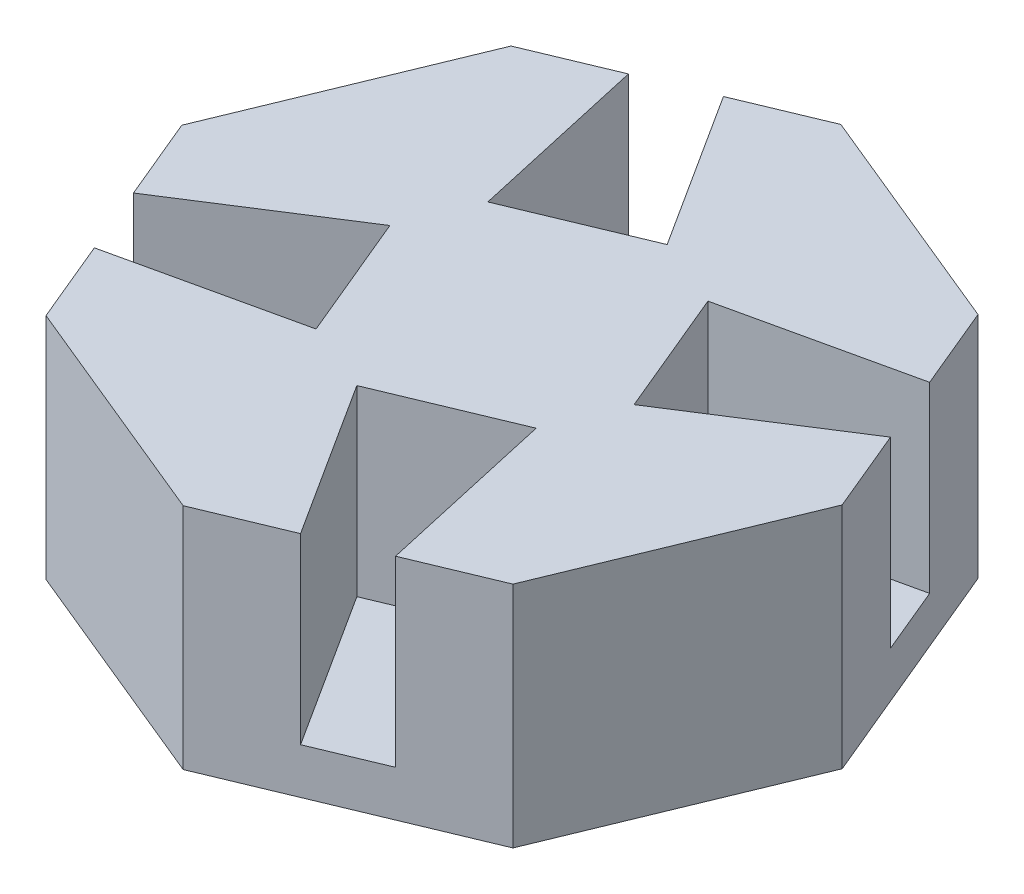
ISO-10303-21;
HEADER;
FILE_DESCRIPTION(('STEP AP214'),'2;1');
FILE_NAME('part.step','',(''),(''),'','','');
FILE_SCHEMA(('AUTOMOTIVE_DESIGN { 1 0 10303 214 1 1 1 1 }'));
ENDSEC;
DATA;
#1=APPLICATION_CONTEXT('core data for automotive mechanical design processes');
#2=APPLICATION_PROTOCOL_DEFINITION('international standard','automotive_design',2000,#1);
#3=PRODUCT_CONTEXT('',#1,'mechanical');
#4=PRODUCT('Part','Part','',(#3));
#5=PRODUCT_RELATED_PRODUCT_CATEGORY('part','',(#4));
#6=PRODUCT_DEFINITION_FORMATION('','',#4);
#7=PRODUCT_DEFINITION_CONTEXT('part definition',#1,'design');
#8=PRODUCT_DEFINITION('design','',#6,#7);
#9=PRODUCT_DEFINITION_SHAPE('','',#8);
#10=(LENGTH_UNIT() NAMED_UNIT(*) SI_UNIT(.MILLI.,.METRE.));
#11=(NAMED_UNIT(*) PLANE_ANGLE_UNIT() SI_UNIT($,.RADIAN.));
#12=(NAMED_UNIT(*) SI_UNIT($,.STERADIAN.) SOLID_ANGLE_UNIT());
#13=UNCERTAINTY_MEASURE_WITH_UNIT(LENGTH_MEASURE(1.E-05),#10,'distance_accuracy_value','');
#14=(GEOMETRIC_REPRESENTATION_CONTEXT(3) GLOBAL_UNCERTAINTY_ASSIGNED_CONTEXT((#13)) GLOBAL_UNIT_ASSIGNED_CONTEXT((#10,
#11,#12)) REPRESENTATION_CONTEXT('',''));
#15=CARTESIAN_POINT('',(0.,0.,0.));
#16=DIRECTION('',(0.,0.,1.));
#17=DIRECTION('',(1.,0.,0.));
#18=AXIS2_PLACEMENT_3D('',#15,#16,#17);
#19=CARTESIAN_POINT('',(-0.111992667325423,38.1,-54.9379232963896));
#20=DIRECTION('',(0.384565990508202,0.,0.923097502403969));
#21=DIRECTION('',(0.923097502403969,0.,-0.384565990508202));
#22=AXIS2_PLACEMENT_3D('',#19,#20,#21);
#23=PLANE('',#22);
#24=DIRECTION('',(0.,1.,0.));
#25=VECTOR('',#24,1.);
#26=CARTESIAN_POINT('',(-25.1089472041907,7.62000000000001,-44.524095335504));
#27=LINE('',#26,#25);
#28=CARTESIAN_POINT('',(-25.1089472041907,7.62000000000001,-44.524095335504));
#29=VERTEX_POINT('',#28);
#30=CARTESIAN_POINT('',(-25.1089472041907,38.1,-44.524095335504));
#31=VERTEX_POINT('',#30);
#32=EDGE_CURVE('E248',#29,#31,#27,.T.);
#33=ORIENTED_EDGE('',*,*,#32,.F.);
#34=DIRECTION('',(-0.923097502403969,0.,0.384565990508202));
#35=VECTOR('',#34,1.);
#36=CARTESIAN_POINT('',(-19.5190807745089,7.62000000000001,-46.8528553145321));
#37=LINE('',#36,#35);
#38=CARTESIAN_POINT('',(-13.9292143448195,7.62000000000001,-49.1816152935633));
#39=VERTEX_POINT('',#38);
#40=EDGE_CURVE('E272',#39,#29,#37,.T.);
#41=ORIENTED_EDGE('',*,*,#40,.F.);
#42=DIRECTION('',(0.,1.,0.));
#43=VECTOR('',#42,1.);
#44=CARTESIAN_POINT('',(-13.9292143448195,7.62000000000001,-49.1816152935633));
#45=LINE('',#44,#43);
#46=CARTESIAN_POINT('',(-13.9292143448195,38.1,-49.1816152935633));
#47=VERTEX_POINT('',#46);
#48=EDGE_CURVE('E288',#39,#47,#45,.T.);
#49=ORIENTED_EDGE('',*,*,#48,.T.);
#50=DIRECTION('',(-0.923097502403969,0.,0.384565990508202));
#51=VECTOR('',#50,1.);
#52=CARTESIAN_POINT('',(-0.111992667325423,38.1,-54.9379232963896));
#53=LINE('',#52,#51);
#54=CARTESIAN_POINT('',(-0.111992667325423,38.1,-54.9379232963896));
#55=VERTEX_POINT('',#54);
#56=EDGE_CURVE('E379',#55,#47,#53,.T.);
#57=ORIENTED_EDGE('',*,*,#56,.F.);
#58=DIRECTION('',(0.,-1.,0.));
#59=VECTOR('',#58,1.);
#60=CARTESIAN_POINT('',(-0.111992667325423,38.1,-54.9379232963896));
#61=LINE('',#60,#59);
#62=CARTESIAN_POINT('',(-0.111992667325423,0.,-54.9379232963896));
#63=VERTEX_POINT('',#62);
#64=EDGE_CURVE('E11',#55,#63,#61,.T.);
#65=ORIENTED_EDGE('',*,*,#64,.T.);
#66=DIRECTION('',(-0.923097502403969,0.,0.384565990508202));
#67=VECTOR('',#66,1.);
#68=CARTESIAN_POINT('',(-0.111992667325423,0.,-54.9379232963896));
#69=LINE('',#68,#67);
#70=CARTESIAN_POINT('',(-38.9261688816924,0.,-38.7677873326745));
#71=VERTEX_POINT('',#70);
#72=EDGE_CURVE('E411',#63,#71,#69,.T.);
#73=ORIENTED_EDGE('',*,*,#72,.T.);
#74=DIRECTION('',(0.,-1.,0.));
#75=VECTOR('',#74,1.);
#76=CARTESIAN_POINT('',(-38.9261688816924,38.1,-38.7677873326745));
#77=LINE('',#76,#75);
#78=CARTESIAN_POINT('',(-38.9261688816924,38.1,-38.7677873326745));
#79=VERTEX_POINT('',#78);
#80=EDGE_CURVE('E54',#79,#71,#77,.T.);
#81=ORIENTED_EDGE('',*,*,#80,.F.);
#82=EDGE_CURVE('E377',#31,#79,#53,.T.);
#83=ORIENTED_EDGE('',*,*,#82,.F.);
#84=EDGE_LOOP('',(#33,#41,#49,#57,#65,#73,#81,#83));
#85=FACE_BOUND('',#84,.T.);
#86=ADVANCED_FACE('F45',(#85),#23,.F.);
#87=CARTESIAN_POINT('',(-54.9379232963896,38.1,0.111992667325427));
#88=DIRECTION('',(0.923097502403969,0.,-0.384565990508202));
#89=DIRECTION('',(-0.384565990508203,0.,-0.923097502403969));
#90=AXIS2_PLACEMENT_3D('',#87,#88,#89);
#91=PLANE('',#90);
#92=DIRECTION('',(0.,1.,0.));
#93=VECTOR('',#92,1.);
#94=CARTESIAN_POINT('',(-44.5240953355033,7.62000000000001,25.1089472041923));
#95=LINE('',#94,#93);
#96=CARTESIAN_POINT('',(-44.5240953355033,7.62000000000001,25.1089472041923));
#97=VERTEX_POINT('',#96);
#98=CARTESIAN_POINT('',(-44.5240953355033,38.1,25.1089472041923));
#99=VERTEX_POINT('',#98);
#100=EDGE_CURVE('E251',#97,#99,#95,.T.);
#101=ORIENTED_EDGE('',*,*,#100,.F.);
#102=DIRECTION('',(0.384565990508203,0.,0.923097502403969));
#103=VECTOR('',#102,1.);
#104=CARTESIAN_POINT('',(-46.8528553145321,7.62000000000001,19.5190807745089));
#105=LINE('',#104,#103);
#106=CARTESIAN_POINT('',(-49.1816152935624,7.62000000000001,13.9292143448218));
#107=VERTEX_POINT('',#106);
#108=EDGE_CURVE('E230',#107,#97,#105,.T.);
#109=ORIENTED_EDGE('',*,*,#108,.F.);
#110=DIRECTION('',(0.,1.,0.));
#111=VECTOR('',#110,1.);
#112=CARTESIAN_POINT('',(-49.1816152935624,7.62000000000001,13.9292143448218));
#113=LINE('',#112,#111);
#114=CARTESIAN_POINT('',(-49.1816152935624,38.1,13.9292143448218));
#115=VERTEX_POINT('',#114);
#116=EDGE_CURVE('E255',#107,#115,#113,.T.);
#117=ORIENTED_EDGE('',*,*,#116,.T.);
#118=DIRECTION('',(0.384565990508203,0.,0.923097502403969));
#119=VECTOR('',#118,1.);
#120=CARTESIAN_POINT('',(-54.9379232963896,38.1,0.111992667325427));
#121=LINE('',#120,#119);
#122=CARTESIAN_POINT('',(-54.9379232963896,38.1,0.111992667325427));
#123=VERTEX_POINT('',#122);
#124=EDGE_CURVE('E387',#123,#115,#121,.T.);
#125=ORIENTED_EDGE('',*,*,#124,.F.);
#126=DIRECTION('',(0.,-1.,0.));
#127=VECTOR('',#126,1.);
#128=CARTESIAN_POINT('',(-54.9379232963896,38.1,0.111992667325427));
#129=LINE('',#128,#127);
#130=CARTESIAN_POINT('',(-54.9379232963896,0.,0.111992667325427));
#131=VERTEX_POINT('',#130);
#132=EDGE_CURVE('E450',#123,#131,#129,.T.);
#133=ORIENTED_EDGE('',*,*,#132,.T.);
#134=DIRECTION('',(0.384565990508203,0.,0.923097502403969));
#135=VECTOR('',#134,1.);
#136=CARTESIAN_POINT('',(-54.9379232963896,0.,0.111992667325427));
#137=LINE('',#136,#135);
#138=CARTESIAN_POINT('',(-38.7677873326745,0.,38.9261688816925));
#139=VERTEX_POINT('',#138);
#140=EDGE_CURVE('E417',#131,#139,#137,.T.);
#141=ORIENTED_EDGE('',*,*,#140,.T.);
#142=DIRECTION('',(0.,-1.,0.));
#143=VECTOR('',#142,1.);
#144=CARTESIAN_POINT('',(-38.7677873326745,38.1,38.9261688816925));
#145=LINE('',#144,#143);
#146=CARTESIAN_POINT('',(-38.7677873326745,38.1,38.9261688816925));
#147=VERTEX_POINT('',#146);
#148=EDGE_CURVE('E446',#147,#139,#145,.T.);
#149=ORIENTED_EDGE('',*,*,#148,.F.);
#150=EDGE_CURVE('E386',#99,#147,#121,.T.);
#151=ORIENTED_EDGE('',*,*,#150,.F.);
#152=EDGE_LOOP('',(#101,#109,#117,#125,#133,#141,#149,#151));
#153=FACE_BOUND('',#152,.T.);
#154=ADVANCED_FACE('F471',(#153),#91,.F.);
#155=CARTESIAN_POINT('',(0.111992667325429,38.1,54.9379232963896));
#156=DIRECTION('',(-0.384565990508203,0.,-0.923097502403969));
#157=DIRECTION('',(-0.923097502403969,0.,0.384565990508203));
#158=AXIS2_PLACEMENT_3D('',#155,#156,#157);
#159=PLANE('',#158);
#160=DIRECTION('',(0.,1.,0.));
#161=VECTOR('',#160,1.);
#162=CARTESIAN_POINT('',(25.1089472041945,7.62000000000001,44.5240953355024));
#163=LINE('',#162,#161);
#164=CARTESIAN_POINT('',(25.1089472041945,7.62000000000001,44.5240953355024));
#165=VERTEX_POINT('',#164);
#166=CARTESIAN_POINT('',(25.1089472041945,38.1,44.5240953355024));
#167=VERTEX_POINT('',#166);
#168=EDGE_CURVE('E363',#165,#167,#163,.T.);
#169=ORIENTED_EDGE('',*,*,#168,.F.);
#170=DIRECTION('',(0.923097502403969,0.,-0.384565990508203));
#171=VECTOR('',#170,1.);
#172=CARTESIAN_POINT('',(19.519080774509,7.62000000000001,46.8528553145321));
#173=LINE('',#172,#171);
#174=CARTESIAN_POINT('',(13.9292143448233,7.62000000000001,49.1816152935618));
#175=VERTEX_POINT('',#174);
#176=EDGE_CURVE('E341',#175,#165,#173,.T.);
#177=ORIENTED_EDGE('',*,*,#176,.F.);
#178=DIRECTION('',(0.,1.,0.));
#179=VECTOR('',#178,1.);
#180=CARTESIAN_POINT('',(13.9292143448233,7.62000000000001,49.1816152935618));
#181=LINE('',#180,#179);
#182=CARTESIAN_POINT('',(13.9292143448233,38.1,49.1816152935618));
#183=VERTEX_POINT('',#182);
#184=EDGE_CURVE('E366',#175,#183,#181,.T.);
#185=ORIENTED_EDGE('',*,*,#184,.T.);
#186=DIRECTION('',(0.923097502403969,0.,-0.384565990508203));
#187=VECTOR('',#186,1.);
#188=CARTESIAN_POINT('',(0.111992667325429,38.1,54.9379232963896));
#189=LINE('',#188,#187);
#190=CARTESIAN_POINT('',(0.111992667325429,38.1,54.9379232963896));
#191=VERTEX_POINT('',#190);
#192=EDGE_CURVE('E395',#191,#183,#189,.T.);
#193=ORIENTED_EDGE('',*,*,#192,.F.);
#194=DIRECTION('',(0.,-1.,0.));
#195=VECTOR('',#194,1.);
#196=CARTESIAN_POINT('',(0.111992667325429,38.1,54.9379232963896));
#197=LINE('',#196,#195);
#198=CARTESIAN_POINT('',(0.111992667325429,0.,54.9379232963896));
#199=VERTEX_POINT('',#198);
#200=EDGE_CURVE('E442',#191,#199,#197,.T.);
#201=ORIENTED_EDGE('',*,*,#200,.T.);
#202=DIRECTION('',(0.923097502403969,0.,-0.384565990508203));
#203=VECTOR('',#202,1.);
#204=CARTESIAN_POINT('',(0.111992667325429,0.,54.9379232963896));
#205=LINE('',#204,#203);
#206=CARTESIAN_POINT('',(38.9261688816925,0.,38.7677873326745));
#207=VERTEX_POINT('',#206);
#208=EDGE_CURVE('E423',#199,#207,#205,.T.);
#209=ORIENTED_EDGE('',*,*,#208,.T.);
#210=DIRECTION('',(0.,-1.,0.));
#211=VECTOR('',#210,1.);
#212=CARTESIAN_POINT('',(38.9261688816925,38.1,38.7677873326745));
#213=LINE('',#212,#211);
#214=CARTESIAN_POINT('',(38.9261688816925,38.1,38.7677873326745));
#215=VERTEX_POINT('',#214);
#216=EDGE_CURVE('E438',#215,#207,#213,.T.);
#217=ORIENTED_EDGE('',*,*,#216,.F.);
#218=EDGE_CURVE('E394',#167,#215,#189,.T.);
#219=ORIENTED_EDGE('',*,*,#218,.F.);
#220=EDGE_LOOP('',(#169,#177,#185,#193,#201,#209,#217,#219));
#221=FACE_BOUND('',#220,.T.);
#222=ADVANCED_FACE('F515',(#221),#159,.F.);
#223=CARTESIAN_POINT('',(54.9379232963896,38.1,-0.111992667325405));
#224=DIRECTION('',(-0.923097502403969,0.,0.384565990508202));
#225=DIRECTION('',(0.384565990508202,0.,0.923097502403969));
#226=AXIS2_PLACEMENT_3D('',#223,#224,#225);
#227=PLANE('',#226);
#228=DIRECTION('',(0.,1.,0.));
#229=VECTOR('',#228,1.);
#230=CARTESIAN_POINT('',(44.5240953355031,7.62000000000001,-25.1089472041929));
#231=LINE('',#230,#229);
#232=CARTESIAN_POINT('',(44.5240953355031,7.62000000000001,-25.1089472041929));
#233=VERTEX_POINT('',#232);
#234=CARTESIAN_POINT('',(44.5240953355031,38.1,-25.1089472041929));
#235=VERTEX_POINT('',#234);
#236=EDGE_CURVE('E280',#233,#235,#231,.T.);
#237=ORIENTED_EDGE('',*,*,#236,.F.);
#238=DIRECTION('',(-0.384565990508202,0.,-0.923097502403969));
#239=VECTOR('',#238,1.);
#240=CARTESIAN_POINT('',(46.8528553145321,7.62000000000001,-19.5190807745089));
#241=LINE('',#240,#239);
#242=CARTESIAN_POINT('',(49.1816152935627,7.62000000000001,-13.9292143448211));
#243=VERTEX_POINT('',#242);
#244=EDGE_CURVE('E308',#243,#233,#241,.T.);
#245=ORIENTED_EDGE('',*,*,#244,.F.);
#246=DIRECTION('',(0.,1.,0.));
#247=VECTOR('',#246,1.);
#248=CARTESIAN_POINT('',(49.1816152935627,7.62000000000001,-13.9292143448211));
#249=LINE('',#248,#247);
#250=CARTESIAN_POINT('',(49.1816152935627,38.1,-13.9292143448211));
#251=VERTEX_POINT('',#250);
#252=EDGE_CURVE('E323',#243,#251,#249,.T.);
#253=ORIENTED_EDGE('',*,*,#252,.T.);
#254=DIRECTION('',(-0.384565990508202,0.,-0.923097502403969));
#255=VECTOR('',#254,1.);
#256=CARTESIAN_POINT('',(54.9379232963896,38.1,-0.111992667325405));
#257=LINE('',#256,#255);
#258=CARTESIAN_POINT('',(54.9379232963896,38.1,-0.111992667325405));
#259=VERTEX_POINT('',#258);
#260=EDGE_CURVE('E403',#259,#251,#257,.T.);
#261=ORIENTED_EDGE('',*,*,#260,.F.);
#262=DIRECTION('',(0.,-1.,0.));
#263=VECTOR('',#262,1.);
#264=CARTESIAN_POINT('',(54.9379232963896,38.1,-0.111992667325405));
#265=LINE('',#264,#263);
#266=CARTESIAN_POINT('',(54.9379232963896,0.,-0.111992667325405));
#267=VERTEX_POINT('',#266);
#268=EDGE_CURVE('E434',#259,#267,#265,.T.);
#269=ORIENTED_EDGE('',*,*,#268,.T.);
#270=DIRECTION('',(-0.384565990508202,0.,-0.923097502403969));
#271=VECTOR('',#270,1.);
#272=CARTESIAN_POINT('',(54.9379232963896,0.,-0.111992667325405));
#273=LINE('',#272,#271);
#274=CARTESIAN_POINT('',(38.7677873326746,0.,-38.9261688816924));
#275=VERTEX_POINT('',#274);
#276=EDGE_CURVE('E378',#267,#275,#273,.T.);
#277=ORIENTED_EDGE('',*,*,#276,.T.);
#278=DIRECTION('',(0.,-1.,0.));
#279=VECTOR('',#278,1.);
#280=CARTESIAN_POINT('',(38.7677873326746,38.1,-38.9261688816924));
#281=LINE('',#280,#279);
#282=CARTESIAN_POINT('',(38.7677873326746,38.1,-38.9261688816924));
#283=VERTEX_POINT('',#282);
#284=EDGE_CURVE('E407',#283,#275,#281,.T.);
#285=ORIENTED_EDGE('',*,*,#284,.F.);
#286=EDGE_CURVE('E402',#235,#283,#257,.T.);
#287=ORIENTED_EDGE('',*,*,#286,.F.);
#288=EDGE_LOOP('',(#237,#245,#253,#261,#269,#277,#285,#287));
#289=FACE_BOUND('',#288,.T.);
#290=ADVANCED_FACE('F505',(#289),#227,.F.);
#291=CARTESIAN_POINT('',(0.,38.1,0.));
#292=DIRECTION('',(0.,1.,0.));
#293=DIRECTION('',(0.,0.,1.));
#294=AXIS2_PLACEMENT_3D('',#291,#292,#293);
#295=PLANE('',#294);
#296=DIRECTION('',(-0.384565990508192,0.,-0.923097502403973));
#297=VECTOR('',#296,1.);
#298=CARTESIAN_POINT('',(18.716843441261,38.1,-7.79750938381947));
#299=LINE('',#298,#297);
#300=CARTESIAN_POINT('',(23.1124327127702,38.1,2.75349506865927));
#301=VERTEX_POINT('',#300);
#302=CARTESIAN_POINT('',(14.321254169753,38.1,-18.3485138362956));
#303=VERTEX_POINT('',#302);
#304=EDGE_CURVE('E315',#301,#303,#299,.T.);
#305=ORIENTED_EDGE('',*,*,#304,.T.);
#306=DIRECTION('',(0.975852760598065,0.,-0.218429369895938));
#307=VECTOR('',#306,1.);
#308=CARTESIAN_POINT('',(-3.22778876040923,38.1,-14.4204351913544));
#309=LINE('',#308,#307);
#310=EDGE_CURVE('E61',#303,#235,#309,.T.);
#311=ORIENTED_EDGE('',*,*,#310,.T.);
#312=ORIENTED_EDGE('',*,*,#286,.T.);
#313=DIRECTION('',(-0.924657723348283,0.,-0.38079928394414));
#314=VECTOR('',#313,1.);
#315=CARTESIAN_POINT('',(38.7677873326746,38.1,-38.9261688816924));
#316=LINE('',#315,#314);
#317=EDGE_CURVE('E373',#283,#55,#316,.T.);
#318=ORIENTED_EDGE('',*,*,#317,.T.);
#319=ORIENTED_EDGE('',*,*,#56,.T.);
#320=DIRECTION('',(-0.539017768098629,0.,-0.842294393709214));
#321=VECTOR('',#320,1.);
#322=CARTESIAN_POINT('',(12.4468077633807,38.1,-7.96520859058015));
#323=LINE('',#322,#321);
#324=CARTESIAN_POINT('',(2.75349506866189,38.1,-23.1124327127691));
#325=VERTEX_POINT('',#324);
#326=EDGE_CURVE('E265',#325,#47,#323,.T.);
#327=ORIENTED_EDGE('',*,*,#326,.F.);
#328=DIRECTION('',(-0.923097502403973,0.,0.384565990508192));
#329=VECTOR('',#328,1.);
#330=CARTESIAN_POINT('',(-7.79750938381868,38.1,-18.7168434412591));
#331=LINE('',#330,#329);
#332=CARTESIAN_POINT('',(-18.3485138362929,38.1,-14.3212541697518));
#333=VERTEX_POINT('',#332);
#334=EDGE_CURVE('E279',#325,#333,#331,.T.);
#335=ORIENTED_EDGE('',*,*,#334,.T.);
#336=DIRECTION('',(-0.218429369895938,0.,-0.975852760598065));
#337=VECTOR('',#336,1.);
#338=CARTESIAN_POINT('',(-14.4204351913522,38.1,3.22778876040873));
#339=LINE('',#338,#337);
#340=EDGE_CURVE('E69',#333,#31,#339,.T.);
#341=ORIENTED_EDGE('',*,*,#340,.T.);
#342=ORIENTED_EDGE('',*,*,#82,.T.);
#343=DIRECTION('',(-0.38079928394414,0.,0.924657723348283));
#344=VECTOR('',#343,1.);
#345=CARTESIAN_POINT('',(-38.9261688816924,38.1,-38.7677873326745));
#346=LINE('',#345,#344);
#347=EDGE_CURVE('E383',#79,#123,#346,.T.);
#348=ORIENTED_EDGE('',*,*,#347,.T.);
#349=ORIENTED_EDGE('',*,*,#124,.T.);
#350=DIRECTION('',(-0.842294393709214,0.,0.539017768098629));
#351=VECTOR('',#350,1.);
#352=CARTESIAN_POINT('',(-7.96520859057888,38.1,-12.4468077633787));
#353=LINE('',#352,#351);
#354=CARTESIAN_POINT('',(-23.1124327127665,38.1,-2.75349506866076));
#355=VERTEX_POINT('',#354);
#356=EDGE_CURVE('E236',#355,#115,#353,.T.);
#357=ORIENTED_EDGE('',*,*,#356,.F.);
#358=DIRECTION('',(0.384565990508192,0.,0.923097502403973));
#359=VECTOR('',#358,1.);
#360=CARTESIAN_POINT('',(-18.7168434412573,38.1,7.79750938381792));
#361=LINE('',#360,#359);
#362=CARTESIAN_POINT('',(-14.3212541697492,38.1,18.3485138362941));
#363=VERTEX_POINT('',#362);
#364=EDGE_CURVE('E239',#355,#363,#361,.T.);
#365=ORIENTED_EDGE('',*,*,#364,.T.);
#366=DIRECTION('',(-0.975852760598065,0.,0.218429369895937));
#367=VECTOR('',#366,1.);
#368=CARTESIAN_POINT('',(3.22778876040909,38.1,14.4204351913538));
#369=LINE('',#368,#367);
#370=EDGE_CURVE('E228',#363,#99,#369,.T.);
#371=ORIENTED_EDGE('',*,*,#370,.T.);
#372=ORIENTED_EDGE('',*,*,#150,.T.);
#373=DIRECTION('',(0.924657723348283,0.,0.38079928394414));
#374=VECTOR('',#373,1.);
#375=CARTESIAN_POINT('',(-38.7677873326745,38.1,38.9261688816925));
#376=LINE('',#375,#374);
#377=EDGE_CURVE('E391',#147,#191,#376,.T.);
#378=ORIENTED_EDGE('',*,*,#377,.T.);
#379=ORIENTED_EDGE('',*,*,#192,.T.);
#380=DIRECTION('',(0.539017768098629,0.,0.842294393709214));
#381=VECTOR('',#380,1.);
#382=CARTESIAN_POINT('',(-12.4468077633773,38.1,7.96520859057801));
#383=LINE('',#382,#381);
#384=CARTESIAN_POINT('',(-2.75349506865813,38.1,23.1124327127676));
#385=VERTEX_POINT('',#384);
#386=EDGE_CURVE('E352',#385,#183,#383,.T.);
#387=ORIENTED_EDGE('',*,*,#386,.F.);
#388=DIRECTION('',(0.923097502403973,0.,-0.384565990508192));
#389=VECTOR('',#388,1.);
#390=CARTESIAN_POINT('',(7.79750938381871,38.1,18.7168434412592));
#391=LINE('',#390,#389);
#392=CARTESIAN_POINT('',(18.3485138362967,38.1,14.3212541697503));
#393=VERTEX_POINT('',#392);
#394=EDGE_CURVE('E254',#385,#393,#391,.T.);
#395=ORIENTED_EDGE('',*,*,#394,.T.);
#396=DIRECTION('',(0.218429369895938,0.,0.975852760598065));
#397=VECTOR('',#396,1.);
#398=CARTESIAN_POINT('',(14.4204351913561,38.1,-3.2277887604096));
#399=LINE('',#398,#397);
#400=EDGE_CURVE('E337',#393,#167,#399,.T.);
#401=ORIENTED_EDGE('',*,*,#400,.T.);
#402=ORIENTED_EDGE('',*,*,#218,.T.);
#403=DIRECTION('',(0.38079928394414,0.,-0.924657723348283));
#404=VECTOR('',#403,1.);
#405=CARTESIAN_POINT('',(38.9261688816925,38.1,38.7677873326745));
#406=LINE('',#405,#404);
#407=EDGE_CURVE('E399',#215,#259,#406,.T.);
#408=ORIENTED_EDGE('',*,*,#407,.T.);
#409=ORIENTED_EDGE('',*,*,#260,.T.);
#410=DIRECTION('',(0.842294393709214,0.,-0.539017768098629));
#411=VECTOR('',#410,1.);
#412=CARTESIAN_POINT('',(7.96520859057929,38.1,12.4468077633793));
#413=LINE('',#412,#411);
#414=EDGE_CURVE('E301',#301,#251,#413,.T.);
#415=ORIENTED_EDGE('',*,*,#414,.F.);
#416=EDGE_LOOP('',(#305,#311,#312,#318,#319,#327,#335,#341,#342,#348,#349,#357,#365,#371,#372,
#378,#379,#387,#395,#401,#402,#408,#409,#415));
#417=FACE_BOUND('',#416,.T.);
#418=ADVANCED_FACE('F480',(#417),#295,.T.);
#419=CARTESIAN_POINT('',(38.7677873326746,38.1,-38.9261688816924));
#420=DIRECTION('',(-0.38079928394414,0.,0.924657723348283));
#421=DIRECTION('',(0.924657723348283,0.,0.38079928394414));
#422=AXIS2_PLACEMENT_3D('',#419,#420,#421);
#423=PLANE('',#422);
#424=DIRECTION('',(-0.924657723348283,0.,-0.38079928394414));
#425=VECTOR('',#424,1.);
#426=CARTESIAN_POINT('',(38.7677873326746,0.,-38.9261688816924));
#427=LINE('',#426,#425);
#428=EDGE_CURVE('E362',#275,#63,#427,.T.);
#429=ORIENTED_EDGE('',*,*,#428,.T.);
#430=ORIENTED_EDGE('',*,*,#64,.F.);
#431=ORIENTED_EDGE('',*,*,#317,.F.);
#432=ORIENTED_EDGE('',*,*,#284,.T.);
#433=EDGE_LOOP('',(#429,#430,#431,#432));
#434=FACE_BOUND('',#433,.T.);
#435=ADVANCED_FACE('F47',(#434),#423,.F.);
#436=CARTESIAN_POINT('',(-38.9261688816924,38.1,-38.7677873326745));
#437=DIRECTION('',(0.924657723348283,0.,0.38079928394414));
#438=DIRECTION('',(0.38079928394414,0.,-0.924657723348283));
#439=AXIS2_PLACEMENT_3D('',#436,#437,#438);
#440=PLANE('',#439);
#441=DIRECTION('',(-0.38079928394414,0.,0.924657723348283));
#442=VECTOR('',#441,1.);
#443=CARTESIAN_POINT('',(-38.9261688816924,0.,-38.7677873326745));
#444=LINE('',#443,#442);
#445=EDGE_CURVE('E414',#71,#131,#444,.T.);
#446=ORIENTED_EDGE('',*,*,#445,.T.);
#447=ORIENTED_EDGE('',*,*,#132,.F.);
#448=ORIENTED_EDGE('',*,*,#347,.F.);
#449=ORIENTED_EDGE('',*,*,#80,.T.);
#450=EDGE_LOOP('',(#446,#447,#448,#449));
#451=FACE_BOUND('',#450,.T.);
#452=ADVANCED_FACE('F459',(#451),#440,.F.);
#453=CARTESIAN_POINT('',(-38.7677873326745,38.1,38.9261688816925));
#454=DIRECTION('',(0.38079928394414,0.,-0.924657723348283));
#455=DIRECTION('',(-0.924657723348283,0.,-0.38079928394414));
#456=AXIS2_PLACEMENT_3D('',#453,#454,#455);
#457=PLANE('',#456);
#458=DIRECTION('',(0.924657723348283,0.,0.38079928394414));
#459=VECTOR('',#458,1.);
#460=CARTESIAN_POINT('',(-38.7677873326745,0.,38.9261688816925));
#461=LINE('',#460,#459);
#462=EDGE_CURVE('E420',#139,#199,#461,.T.);
#463=ORIENTED_EDGE('',*,*,#462,.T.);
#464=ORIENTED_EDGE('',*,*,#200,.F.);
#465=ORIENTED_EDGE('',*,*,#377,.F.);
#466=ORIENTED_EDGE('',*,*,#148,.T.);
#467=EDGE_LOOP('',(#463,#464,#465,#466));
#468=FACE_BOUND('',#467,.T.);
#469=ADVANCED_FACE('F476',(#468),#457,.F.);
#470=CARTESIAN_POINT('',(38.9261688816925,38.1,38.7677873326745));
#471=DIRECTION('',(-0.924657723348283,0.,-0.38079928394414));
#472=DIRECTION('',(-0.38079928394414,0.,0.924657723348283));
#473=AXIS2_PLACEMENT_3D('',#470,#471,#472);
#474=PLANE('',#473);
#475=DIRECTION('',(0.38079928394414,0.,-0.924657723348283));
#476=VECTOR('',#475,1.);
#477=CARTESIAN_POINT('',(38.9261688816925,0.,38.7677873326745));
#478=LINE('',#477,#476);
#479=EDGE_CURVE('E426',#207,#267,#478,.T.);
#480=ORIENTED_EDGE('',*,*,#479,.T.);
#481=ORIENTED_EDGE('',*,*,#268,.F.);
#482=ORIENTED_EDGE('',*,*,#407,.F.);
#483=ORIENTED_EDGE('',*,*,#216,.T.);
#484=EDGE_LOOP('',(#480,#481,#482,#483));
#485=FACE_BOUND('',#484,.T.);
#486=ADVANCED_FACE('F510',(#485),#474,.F.);
#487=CARTESIAN_POINT('',(0.,0.,0.));
#488=DIRECTION('',(0.,1.,0.));
#489=DIRECTION('',(0.,0.,1.));
#490=AXIS2_PLACEMENT_3D('',#487,#488,#489);
#491=PLANE('',#490);
#492=ORIENTED_EDGE('',*,*,#428,.F.);
#493=ORIENTED_EDGE('',*,*,#276,.F.);
#494=ORIENTED_EDGE('',*,*,#479,.F.);
#495=ORIENTED_EDGE('',*,*,#208,.F.);
#496=ORIENTED_EDGE('',*,*,#462,.F.);
#497=ORIENTED_EDGE('',*,*,#140,.F.);
#498=ORIENTED_EDGE('',*,*,#445,.F.);
#499=ORIENTED_EDGE('',*,*,#72,.F.);
#500=EDGE_LOOP('',(#492,#493,#494,#495,#496,#497,#498,#499));
#501=FACE_BOUND('',#500,.T.);
#502=ADVANCED_FACE('F466',(#501),#491,.F.);
#503=CARTESIAN_POINT('',(7.79750938381871,7.62000000000001,18.7168434412592));
#504=DIRECTION('',(0.384565990508192,0.,0.923097502403973));
#505=DIRECTION('',(0.923097502403973,0.,-0.384565990508192));
#506=AXIS2_PLACEMENT_3D('',#503,#504,#505);
#507=PLANE('',#506);
#508=ORIENTED_EDGE('',*,*,#394,.F.);
#509=DIRECTION('',(0.,1.,0.));
#510=VECTOR('',#509,1.);
#511=CARTESIAN_POINT('',(-2.75349506865814,7.62000000000001,23.1124327127676));
#512=LINE('',#511,#510);
#513=CARTESIAN_POINT('',(-2.75349506865814,7.62000000000001,23.1124327127676));
#514=VERTEX_POINT('',#513);
#515=EDGE_CURVE('E348',#514,#385,#512,.T.);
#516=ORIENTED_EDGE('',*,*,#515,.F.);
#517=DIRECTION('',(0.923097502403973,0.,-0.384565990508192));
#518=VECTOR('',#517,1.);
#519=CARTESIAN_POINT('',(7.79750938381871,7.62000000000001,18.7168434412592));
#520=LINE('',#519,#518);
#521=CARTESIAN_POINT('',(18.3485138362967,7.62000000000001,14.3212541697503));
#522=VERTEX_POINT('',#521);
#523=EDGE_CURVE('E332',#514,#522,#520,.T.);
#524=ORIENTED_EDGE('',*,*,#523,.T.);
#525=DIRECTION('',(0.,1.,0.));
#526=VECTOR('',#525,1.);
#527=CARTESIAN_POINT('',(18.3485138362967,7.62000000000001,14.3212541697503));
#528=LINE('',#527,#526);
#529=EDGE_CURVE('E358',#522,#393,#528,.T.);
#530=ORIENTED_EDGE('',*,*,#529,.T.);
#531=EDGE_LOOP('',(#508,#516,#524,#530));
#532=FACE_BOUND('',#531,.T.);
#533=ADVANCED_FACE('F525',(#532),#507,.T.);
#534=CARTESIAN_POINT('',(14.4204351913561,7.62000000000001,-3.2277887604096));
#535=DIRECTION('',(-0.975852760598065,0.,0.218429369895938));
#536=DIRECTION('',(0.218429369895938,0.,0.975852760598065));
#537=AXIS2_PLACEMENT_3D('',#534,#535,#536);
#538=PLANE('',#537);
#539=ORIENTED_EDGE('',*,*,#400,.F.);
#540=ORIENTED_EDGE('',*,*,#529,.F.);
#541=DIRECTION('',(0.218429369895938,0.,0.975852760598065));
#542=VECTOR('',#541,1.);
#543=CARTESIAN_POINT('',(14.4204351913561,7.62000000000001,-3.2277887604096));
#544=LINE('',#543,#542);
#545=EDGE_CURVE('E345',#522,#165,#544,.T.);
#546=ORIENTED_EDGE('',*,*,#545,.T.);
#547=ORIENTED_EDGE('',*,*,#168,.T.);
#548=EDGE_LOOP('',(#539,#540,#546,#547));
#549=FACE_BOUND('',#548,.T.);
#550=ADVANCED_FACE('F527',(#549),#538,.T.);
#551=CARTESIAN_POINT('',(-12.4468077633773,7.62000000000001,7.96520859057801));
#552=DIRECTION('',(-0.842294393709214,0.,0.539017768098629));
#553=DIRECTION('',(0.539017768098629,0.,0.842294393709214));
#554=AXIS2_PLACEMENT_3D('',#551,#552,#553);
#555=PLANE('',#554);
#556=ORIENTED_EDGE('',*,*,#386,.T.);
#557=ORIENTED_EDGE('',*,*,#184,.F.);
#558=DIRECTION('',(0.539017768098629,0.,0.842294393709214));
#559=VECTOR('',#558,1.);
#560=CARTESIAN_POINT('',(-12.4468077633773,7.62000000000001,7.96520859057801));
#561=LINE('',#560,#559);
#562=EDGE_CURVE('E336',#514,#175,#561,.T.);
#563=ORIENTED_EDGE('',*,*,#562,.F.);
#564=ORIENTED_EDGE('',*,*,#515,.T.);
#565=EDGE_LOOP('',(#556,#557,#563,#564));
#566=FACE_BOUND('',#565,.T.);
#567=ADVANCED_FACE('F519',(#566),#555,.F.);
#568=CARTESIAN_POINT('',(0.,7.62000000000001,0.));
#569=DIRECTION('',(0.,1.,0.));
#570=DIRECTION('',(0.,0.,1.));
#571=AXIS2_PLACEMENT_3D('',#568,#569,#570);
#572=PLANE('',#571);
#573=ORIENTED_EDGE('',*,*,#523,.F.);
#574=ORIENTED_EDGE('',*,*,#562,.T.);
#575=ORIENTED_EDGE('',*,*,#176,.T.);
#576=ORIENTED_EDGE('',*,*,#545,.F.);
#577=EDGE_LOOP('',(#573,#574,#575,#576));
#578=FACE_BOUND('',#577,.T.);
#579=ADVANCED_FACE('F522',(#578),#572,.T.);
#580=CARTESIAN_POINT('',(3.22778876040909,7.62000000000001,14.4204351913538));
#581=DIRECTION('',(-0.218429369895937,0.,-0.975852760598065));
#582=DIRECTION('',(-0.975852760598065,0.,0.218429369895938));
#583=AXIS2_PLACEMENT_3D('',#580,#581,#582);
#584=PLANE('',#583);
#585=ORIENTED_EDGE('',*,*,#370,.F.);
#586=DIRECTION('',(0.,1.,0.));
#587=VECTOR('',#586,1.);
#588=CARTESIAN_POINT('',(-14.3212541697492,7.62000000000001,18.3485138362941));
#589=LINE('',#588,#587);
#590=CARTESIAN_POINT('',(-14.3212541697492,7.62000000000001,18.3485138362941));
#591=VERTEX_POINT('',#590);
#592=EDGE_CURVE('E213',#591,#363,#589,.T.);
#593=ORIENTED_EDGE('',*,*,#592,.F.);
#594=DIRECTION('',(-0.975852760598065,0.,0.218429369895937));
#595=VECTOR('',#594,1.);
#596=CARTESIAN_POINT('',(3.22778876040909,7.62000000000001,14.4204351913538));
#597=LINE('',#596,#595);
#598=EDGE_CURVE('E222',#591,#97,#597,.T.);
#599=ORIENTED_EDGE('',*,*,#598,.T.);
#600=ORIENTED_EDGE('',*,*,#100,.T.);
#601=EDGE_LOOP('',(#585,#593,#599,#600));
#602=FACE_BOUND('',#601,.T.);
#603=ADVANCED_FACE('F225',(#602),#584,.T.);
#604=CARTESIAN_POINT('',(-7.96520859057888,7.62000000000001,-12.4468077633787));
#605=DIRECTION('',(-0.539017768098629,0.,-0.842294393709214));
#606=DIRECTION('',(-0.842294393709214,0.,0.539017768098629));
#607=AXIS2_PLACEMENT_3D('',#604,#605,#606);
#608=PLANE('',#607);
#609=ORIENTED_EDGE('',*,*,#356,.T.);
#610=ORIENTED_EDGE('',*,*,#116,.F.);
#611=DIRECTION('',(-0.842294393709214,0.,0.539017768098629));
#612=VECTOR('',#611,1.);
#613=CARTESIAN_POINT('',(-7.96520859057888,7.62000000000001,-12.4468077633787));
#614=LINE('',#613,#612);
#615=CARTESIAN_POINT('',(-23.1124327127665,7.62000000000001,-2.75349506866076));
#616=VERTEX_POINT('',#615);
#617=EDGE_CURVE('E221',#616,#107,#614,.T.);
#618=ORIENTED_EDGE('',*,*,#617,.F.);
#619=DIRECTION('',(0.,1.,0.));
#620=VECTOR('',#619,1.);
#621=CARTESIAN_POINT('',(-23.1124327127665,7.62000000000001,-2.75349506866076));
#622=LINE('',#621,#620);
#623=EDGE_CURVE('E215',#616,#355,#622,.T.);
#624=ORIENTED_EDGE('',*,*,#623,.T.);
#625=EDGE_LOOP('',(#609,#610,#618,#624));
#626=FACE_BOUND('',#625,.T.);
#627=ADVANCED_FACE('F583',(#626),#608,.F.);
#628=CARTESIAN_POINT('',(-18.7168434412573,7.62000000000001,7.79750938381792));
#629=DIRECTION('',(-0.923097502403973,0.,0.384565990508192));
#630=DIRECTION('',(0.384565990508192,0.,0.923097502403973));
#631=AXIS2_PLACEMENT_3D('',#628,#629,#630);
#632=PLANE('',#631);
#633=ORIENTED_EDGE('',*,*,#364,.F.);
#634=ORIENTED_EDGE('',*,*,#623,.F.);
#635=DIRECTION('',(0.384565990508192,0.,0.923097502403973));
#636=VECTOR('',#635,1.);
#637=CARTESIAN_POINT('',(-18.7168434412573,7.62000000000001,7.79750938381792));
#638=LINE('',#637,#636);
#639=EDGE_CURVE('E209',#616,#591,#638,.T.);
#640=ORIENTED_EDGE('',*,*,#639,.T.);
#641=ORIENTED_EDGE('',*,*,#592,.T.);
#642=EDGE_LOOP('',(#633,#634,#640,#641));
#643=FACE_BOUND('',#642,.T.);
#644=ADVANCED_FACE('F212',(#643),#632,.T.);
#645=CARTESIAN_POINT('',(0.,7.62000000000001,0.));
#646=DIRECTION('',(0.,1.,0.));
#647=DIRECTION('',(0.,0.,1.));
#648=AXIS2_PLACEMENT_3D('',#645,#646,#647);
#649=PLANE('',#648);
#650=ORIENTED_EDGE('',*,*,#598,.F.);
#651=ORIENTED_EDGE('',*,*,#639,.F.);
#652=ORIENTED_EDGE('',*,*,#617,.T.);
#653=ORIENTED_EDGE('',*,*,#108,.T.);
#654=EDGE_LOOP('',(#650,#651,#652,#653));
#655=FACE_BOUND('',#654,.T.);
#656=ADVANCED_FACE('F232',(#655),#649,.T.);
#657=CARTESIAN_POINT('',(-14.4204351913522,7.62000000000001,3.22778876040873));
#658=DIRECTION('',(0.975852760598065,0.,-0.218429369895938));
#659=DIRECTION('',(-0.218429369895938,0.,-0.975852760598065));
#660=AXIS2_PLACEMENT_3D('',#657,#658,#659);
#661=PLANE('',#660);
#662=ORIENTED_EDGE('',*,*,#340,.F.);
#663=DIRECTION('',(0.,1.,0.));
#664=VECTOR('',#663,1.);
#665=CARTESIAN_POINT('',(-18.3485138362929,7.62000000000001,-14.3212541697518));
#666=LINE('',#665,#664);
#667=CARTESIAN_POINT('',(-18.3485138362929,7.62000000000001,-14.3212541697518));
#668=VERTEX_POINT('',#667);
#669=EDGE_CURVE('E276',#668,#333,#666,.T.);
#670=ORIENTED_EDGE('',*,*,#669,.F.);
#671=DIRECTION('',(-0.218429369895938,0.,-0.975852760598065));
#672=VECTOR('',#671,1.);
#673=CARTESIAN_POINT('',(-14.4204351913522,7.62000000000001,3.22778876040873));
#674=LINE('',#673,#672);
#675=EDGE_CURVE('E261',#668,#29,#674,.T.);
#676=ORIENTED_EDGE('',*,*,#675,.T.);
#677=ORIENTED_EDGE('',*,*,#32,.T.);
#678=EDGE_LOOP('',(#662,#670,#676,#677));
#679=FACE_BOUND('',#678,.T.);
#680=ADVANCED_FACE('F486',(#679),#661,.T.);
#681=CARTESIAN_POINT('',(12.4468077633807,7.62000000000001,-7.96520859058015));
#682=DIRECTION('',(0.842294393709214,0.,-0.539017768098629));
#683=DIRECTION('',(-0.539017768098629,0.,-0.842294393709214));
#684=AXIS2_PLACEMENT_3D('',#681,#682,#683);
#685=PLANE('',#684);
#686=ORIENTED_EDGE('',*,*,#326,.T.);
#687=ORIENTED_EDGE('',*,*,#48,.F.);
#688=DIRECTION('',(-0.539017768098629,0.,-0.842294393709214));
#689=VECTOR('',#688,1.);
#690=CARTESIAN_POINT('',(12.4468077633807,7.62000000000001,-7.96520859058015));
#691=LINE('',#690,#689);
#692=CARTESIAN_POINT('',(2.75349506866189,7.62000000000001,-23.1124327127691));
#693=VERTEX_POINT('',#692);
#694=EDGE_CURVE('E268',#693,#39,#691,.T.);
#695=ORIENTED_EDGE('',*,*,#694,.F.);
#696=DIRECTION('',(0.,1.,0.));
#697=VECTOR('',#696,1.);
#698=CARTESIAN_POINT('',(2.75349506866189,7.62000000000001,-23.1124327127691));
#699=LINE('',#698,#697);
#700=EDGE_CURVE('E292',#693,#325,#699,.T.);
#701=ORIENTED_EDGE('',*,*,#700,.T.);
#702=EDGE_LOOP('',(#686,#687,#695,#701));
#703=FACE_BOUND('',#702,.T.);
#704=ADVANCED_FACE('F493',(#703),#685,.F.);
#705=CARTESIAN_POINT('',(-7.79750938381868,7.62000000000001,-18.7168434412591));
#706=DIRECTION('',(-0.384565990508192,0.,-0.923097502403973));
#707=DIRECTION('',(-0.923097502403973,0.,0.384565990508192));
#708=AXIS2_PLACEMENT_3D('',#705,#706,#707);
#709=PLANE('',#708);
#710=ORIENTED_EDGE('',*,*,#334,.F.);
#711=ORIENTED_EDGE('',*,*,#700,.F.);
#712=DIRECTION('',(-0.923097502403973,0.,0.384565990508192));
#713=VECTOR('',#712,1.);
#714=CARTESIAN_POINT('',(-7.79750938381868,7.62000000000001,-18.7168434412591));
#715=LINE('',#714,#713);
#716=EDGE_CURVE('E264',#693,#668,#715,.T.);
#717=ORIENTED_EDGE('',*,*,#716,.T.);
#718=ORIENTED_EDGE('',*,*,#669,.T.);
#719=EDGE_LOOP('',(#710,#711,#717,#718));
#720=FACE_BOUND('',#719,.T.);
#721=ADVANCED_FACE('F550',(#720),#709,.T.);
#722=CARTESIAN_POINT('',(0.,7.62000000000001,0.));
#723=DIRECTION('',(0.,1.,0.));
#724=DIRECTION('',(0.,0.,1.));
#725=AXIS2_PLACEMENT_3D('',#722,#723,#724);
#726=PLANE('',#725);
#727=ORIENTED_EDGE('',*,*,#675,.F.);
#728=ORIENTED_EDGE('',*,*,#716,.F.);
#729=ORIENTED_EDGE('',*,*,#694,.T.);
#730=ORIENTED_EDGE('',*,*,#40,.T.);
#731=EDGE_LOOP('',(#727,#728,#729,#730));
#732=FACE_BOUND('',#731,.T.);
#733=ADVANCED_FACE('F490',(#732),#726,.T.);
#734=CARTESIAN_POINT('',(-3.22778876040923,7.62000000000001,-14.4204351913544));
#735=DIRECTION('',(0.218429369895938,0.,0.975852760598065));
#736=DIRECTION('',(0.975852760598065,0.,-0.218429369895938));
#737=AXIS2_PLACEMENT_3D('',#734,#735,#736);
#738=PLANE('',#737);
#739=ORIENTED_EDGE('',*,*,#310,.F.);
#740=DIRECTION('',(0.,1.,0.));
#741=VECTOR('',#740,1.);
#742=CARTESIAN_POINT('',(14.321254169753,7.62000000000001,-18.3485138362956));
#743=LINE('',#742,#741);
#744=CARTESIAN_POINT('',(14.321254169753,7.62000000000001,-18.3485138362956));
#745=VERTEX_POINT('',#744);
#746=EDGE_CURVE('E312',#745,#303,#743,.T.);
#747=ORIENTED_EDGE('',*,*,#746,.F.);
#748=DIRECTION('',(0.975852760598065,0.,-0.218429369895938));
#749=VECTOR('',#748,1.);
#750=CARTESIAN_POINT('',(-3.22778876040923,7.62000000000001,-14.4204351913544));
#751=LINE('',#750,#749);
#752=EDGE_CURVE('E297',#745,#233,#751,.T.);
#753=ORIENTED_EDGE('',*,*,#752,.T.);
#754=ORIENTED_EDGE('',*,*,#236,.T.);
#755=EDGE_LOOP('',(#739,#747,#753,#754));
#756=FACE_BOUND('',#755,.T.);
#757=ADVANCED_FACE('F542',(#756),#738,.T.);
#758=CARTESIAN_POINT('',(7.96520859057929,7.62000000000001,12.4468077633793));
#759=DIRECTION('',(0.539017768098629,0.,0.842294393709214));
#760=DIRECTION('',(0.842294393709214,0.,-0.539017768098629));
#761=AXIS2_PLACEMENT_3D('',#758,#759,#760);
#762=PLANE('',#761);
#763=ORIENTED_EDGE('',*,*,#414,.T.);
#764=ORIENTED_EDGE('',*,*,#252,.F.);
#765=DIRECTION('',(0.842294393709214,0.,-0.539017768098629));
#766=VECTOR('',#765,1.);
#767=CARTESIAN_POINT('',(7.96520859057929,7.62000000000001,12.4468077633793));
#768=LINE('',#767,#766);
#769=CARTESIAN_POINT('',(23.1124327127702,7.62000000000001,2.75349506865927));
#770=VERTEX_POINT('',#769);
#771=EDGE_CURVE('E304',#770,#243,#768,.T.);
#772=ORIENTED_EDGE('',*,*,#771,.F.);
#773=DIRECTION('',(0.,1.,0.));
#774=VECTOR('',#773,1.);
#775=CARTESIAN_POINT('',(23.1124327127702,7.62000000000001,2.75349506865927));
#776=LINE('',#775,#774);
#777=EDGE_CURVE('E327',#770,#301,#776,.T.);
#778=ORIENTED_EDGE('',*,*,#777,.T.);
#779=EDGE_LOOP('',(#763,#764,#772,#778));
#780=FACE_BOUND('',#779,.T.);
#781=ADVANCED_FACE('F533',(#780),#762,.F.);
#782=CARTESIAN_POINT('',(18.716843441261,7.62000000000001,-7.79750938381947));
#783=DIRECTION('',(0.923097502403973,0.,-0.384565990508192));
#784=DIRECTION('',(-0.384565990508192,0.,-0.923097502403973));
#785=AXIS2_PLACEMENT_3D('',#782,#783,#784);
#786=PLANE('',#785);
#787=ORIENTED_EDGE('',*,*,#304,.F.);
#788=ORIENTED_EDGE('',*,*,#777,.F.);
#789=DIRECTION('',(-0.384565990508192,0.,-0.923097502403973));
#790=VECTOR('',#789,1.);
#791=CARTESIAN_POINT('',(18.716843441261,7.62000000000001,-7.79750938381947));
#792=LINE('',#791,#790);
#793=EDGE_CURVE('E300',#770,#745,#792,.T.);
#794=ORIENTED_EDGE('',*,*,#793,.T.);
#795=ORIENTED_EDGE('',*,*,#746,.T.);
#796=EDGE_LOOP('',(#787,#788,#794,#795));
#797=FACE_BOUND('',#796,.T.);
#798=ADVANCED_FACE('F541',(#797),#786,.T.);
#799=CARTESIAN_POINT('',(0.,7.62000000000001,0.));
#800=DIRECTION('',(0.,1.,0.));
#801=DIRECTION('',(0.,0.,1.));
#802=AXIS2_PLACEMENT_3D('',#799,#800,#801);
#803=PLANE('',#802);
#804=ORIENTED_EDGE('',*,*,#752,.F.);
#805=ORIENTED_EDGE('',*,*,#793,.F.);
#806=ORIENTED_EDGE('',*,*,#771,.T.);
#807=ORIENTED_EDGE('',*,*,#244,.T.);
#808=EDGE_LOOP('',(#804,#805,#806,#807));
#809=FACE_BOUND('',#808,.T.);
#810=ADVANCED_FACE('F538',(#809),#803,.T.);
#811=CLOSED_SHELL('',(#86,#154,#222,#290,#418,#435,#452,#469,#486,#502,#533,#550,#567,#579,#603,
#627,#644,#656,#680,#704,#721,#733,#757,#781,#798,#810));
#812=MANIFOLD_SOLID_BREP('B2',#811);
#813=ADVANCED_BREP_SHAPE_REPRESENTATION('',(#18,#812),#14);
#814=SHAPE_DEFINITION_REPRESENTATION(#9,#813);
ENDSEC;
END-ISO-10303-21;
